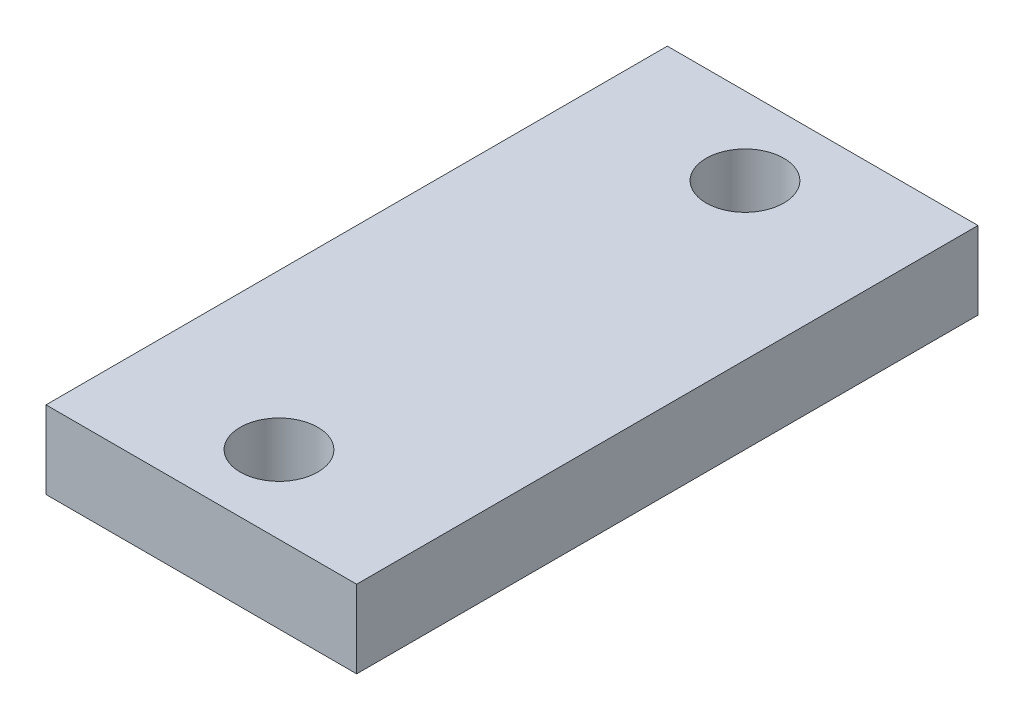
ISO-10303-21;
HEADER;
FILE_DESCRIPTION(('STEP AP214'),'2;1');
FILE_NAME('part.step','',(''),(''),'','','');
FILE_SCHEMA(('AUTOMOTIVE_DESIGN { 1 0 10303 214 1 1 1 1 }'));
ENDSEC;
DATA;
#1=APPLICATION_CONTEXT('core data for automotive mechanical design processes');
#2=APPLICATION_PROTOCOL_DEFINITION('international standard','automotive_design',2000,#1);
#3=PRODUCT_CONTEXT('',#1,'mechanical');
#4=PRODUCT('Part','Part','',(#3));
#5=PRODUCT_RELATED_PRODUCT_CATEGORY('part','',(#4));
#6=PRODUCT_DEFINITION_FORMATION('','',#4);
#7=PRODUCT_DEFINITION_CONTEXT('part definition',#1,'design');
#8=PRODUCT_DEFINITION('design','',#6,#7);
#9=PRODUCT_DEFINITION_SHAPE('','',#8);
#10=(LENGTH_UNIT() NAMED_UNIT(*) SI_UNIT(.MILLI.,.METRE.));
#11=(NAMED_UNIT(*) PLANE_ANGLE_UNIT() SI_UNIT($,.RADIAN.));
#12=(NAMED_UNIT(*) SI_UNIT($,.STERADIAN.) SOLID_ANGLE_UNIT());
#13=UNCERTAINTY_MEASURE_WITH_UNIT(LENGTH_MEASURE(1.E-05),#10,'distance_accuracy_value','');
#14=(GEOMETRIC_REPRESENTATION_CONTEXT(3) GLOBAL_UNCERTAINTY_ASSIGNED_CONTEXT((#13)) GLOBAL_UNIT_ASSIGNED_CONTEXT((#10,
#11,#12)) REPRESENTATION_CONTEXT('',''));
#15=CARTESIAN_POINT('',(0.,0.,0.));
#16=DIRECTION('',(0.,0.,1.));
#17=DIRECTION('',(1.,0.,0.));
#18=AXIS2_PLACEMENT_3D('',#15,#16,#17);
#19=CARTESIAN_POINT('',(12.7,6.35,0.));
#20=DIRECTION('',(-1.,0.,0.));
#21=DIRECTION('',(0.,0.,1.));
#22=AXIS2_PLACEMENT_3D('',#19,#20,#21);
#23=PLANE('',#22);
#24=DIRECTION('',(0.,0.,-1.));
#25=VECTOR('',#24,1.);
#26=CARTESIAN_POINT('',(12.7,0.,0.));
#27=LINE('',#26,#25);
#28=CARTESIAN_POINT('',(12.7,0.,25.4));
#29=VERTEX_POINT('',#28);
#30=CARTESIAN_POINT('',(12.7,0.,-25.4));
#31=VERTEX_POINT('',#30);
#32=EDGE_CURVE('E102',#29,#31,#27,.T.);
#33=ORIENTED_EDGE('',*,*,#32,.T.);
#34=DIRECTION('',(0.,-1.,0.));
#35=VECTOR('',#34,1.);
#36=CARTESIAN_POINT('',(12.7,6.35,-25.4));
#37=LINE('',#36,#35);
#38=CARTESIAN_POINT('',(12.7,6.35,-25.4));
#39=VERTEX_POINT('',#38);
#40=EDGE_CURVE('E11',#39,#31,#37,.T.);
#41=ORIENTED_EDGE('',*,*,#40,.F.);
#42=DIRECTION('',(0.,0.,-1.));
#43=VECTOR('',#42,1.);
#44=CARTESIAN_POINT('',(12.7,6.35,0.));
#45=LINE('',#44,#43);
#46=CARTESIAN_POINT('',(12.7,6.35,25.4));
#47=VERTEX_POINT('',#46);
#48=EDGE_CURVE('E72',#47,#39,#45,.T.);
#49=ORIENTED_EDGE('',*,*,#48,.F.);
#50=DIRECTION('',(0.,-1.,0.));
#51=VECTOR('',#50,1.);
#52=CARTESIAN_POINT('',(12.7,6.35,25.4));
#53=LINE('',#52,#51);
#54=EDGE_CURVE('E98',#47,#29,#53,.T.);
#55=ORIENTED_EDGE('',*,*,#54,.T.);
#56=EDGE_LOOP('',(#33,#41,#49,#55));
#57=FACE_BOUND('',#56,.T.);
#58=ADVANCED_FACE('F32',(#57),#23,.F.);
#59=CARTESIAN_POINT('',(0.,6.35,-25.4));
#60=DIRECTION('',(0.,0.,-1.));
#61=DIRECTION('',(-1.,0.,0.));
#62=AXIS2_PLACEMENT_3D('',#59,#60,#61);
#63=PLANE('',#62);
#64=DIRECTION('',(1.,0.,0.));
#65=VECTOR('',#64,1.);
#66=CARTESIAN_POINT('',(0.,0.,-25.4));
#67=LINE('',#66,#65);
#68=CARTESIAN_POINT('',(-12.7,0.,-25.4));
#69=VERTEX_POINT('',#68);
#70=EDGE_CURVE('E81',#69,#31,#67,.T.);
#71=ORIENTED_EDGE('',*,*,#70,.F.);
#72=DIRECTION('',(0.,-1.,0.));
#73=VECTOR('',#72,1.);
#74=CARTESIAN_POINT('',(-12.7,6.35,-25.4));
#75=LINE('',#74,#73);
#76=CARTESIAN_POINT('',(-12.7,6.35,-25.4));
#77=VERTEX_POINT('',#76);
#78=EDGE_CURVE('E41',#77,#69,#75,.T.);
#79=ORIENTED_EDGE('',*,*,#78,.F.);
#80=DIRECTION('',(1.,0.,0.));
#81=VECTOR('',#80,1.);
#82=CARTESIAN_POINT('',(0.,6.35,-25.4));
#83=LINE('',#82,#81);
#84=EDGE_CURVE('E79',#77,#39,#83,.T.);
#85=ORIENTED_EDGE('',*,*,#84,.T.);
#86=ORIENTED_EDGE('',*,*,#40,.T.);
#87=EDGE_LOOP('',(#71,#79,#85,#86));
#88=FACE_BOUND('',#87,.T.);
#89=ADVANCED_FACE('F78',(#88),#63,.T.);
#90=CARTESIAN_POINT('',(-12.7,6.35,0.));
#91=DIRECTION('',(-1.,0.,0.));
#92=DIRECTION('',(0.,0.,1.));
#93=AXIS2_PLACEMENT_3D('',#90,#91,#92);
#94=PLANE('',#93);
#95=DIRECTION('',(0.,0.,-1.));
#96=VECTOR('',#95,1.);
#97=CARTESIAN_POINT('',(-12.7,0.,0.));
#98=LINE('',#97,#96);
#99=CARTESIAN_POINT('',(-12.7,0.,25.4));
#100=VERTEX_POINT('',#99);
#101=EDGE_CURVE('E106',#100,#69,#98,.T.);
#102=ORIENTED_EDGE('',*,*,#101,.F.);
#103=DIRECTION('',(0.,-1.,0.));
#104=VECTOR('',#103,1.);
#105=CARTESIAN_POINT('',(-12.7,6.35,25.4));
#106=LINE('',#105,#104);
#107=CARTESIAN_POINT('',(-12.7,6.35,25.4));
#108=VERTEX_POINT('',#107);
#109=EDGE_CURVE('E64',#108,#100,#106,.T.);
#110=ORIENTED_EDGE('',*,*,#109,.F.);
#111=DIRECTION('',(0.,0.,-1.));
#112=VECTOR('',#111,1.);
#113=CARTESIAN_POINT('',(-12.7,6.35,0.));
#114=LINE('',#113,#112);
#115=EDGE_CURVE('E88',#108,#77,#114,.T.);
#116=ORIENTED_EDGE('',*,*,#115,.T.);
#117=ORIENTED_EDGE('',*,*,#78,.T.);
#118=EDGE_LOOP('',(#102,#110,#116,#117));
#119=FACE_BOUND('',#118,.T.);
#120=ADVANCED_FACE('F90',(#119),#94,.T.);
#121=CARTESIAN_POINT('',(0.,6.35,25.4));
#122=DIRECTION('',(0.,0.,-1.));
#123=DIRECTION('',(-1.,0.,0.));
#124=AXIS2_PLACEMENT_3D('',#121,#122,#123);
#125=PLANE('',#124);
#126=DIRECTION('',(1.,0.,0.));
#127=VECTOR('',#126,1.);
#128=CARTESIAN_POINT('',(0.,0.,25.4));
#129=LINE('',#128,#127);
#130=EDGE_CURVE('E67',#100,#29,#129,.T.);
#131=ORIENTED_EDGE('',*,*,#130,.T.);
#132=ORIENTED_EDGE('',*,*,#54,.F.);
#133=DIRECTION('',(1.,0.,0.));
#134=VECTOR('',#133,1.);
#135=CARTESIAN_POINT('',(0.,6.35,25.4));
#136=LINE('',#135,#134);
#137=EDGE_CURVE('E49',#108,#47,#136,.T.);
#138=ORIENTED_EDGE('',*,*,#137,.F.);
#139=ORIENTED_EDGE('',*,*,#109,.T.);
#140=EDGE_LOOP('',(#131,#132,#138,#139));
#141=FACE_BOUND('',#140,.T.);
#142=ADVANCED_FACE('F134',(#141),#125,.F.);
#143=CARTESIAN_POINT('',(0.,6.35,19.05));
#144=DIRECTION('',(0.,-1.,0.));
#145=DIRECTION('',(0.,0.,-1.));
#146=AXIS2_PLACEMENT_3D('',#143,#144,#145);
#147=CYLINDRICAL_SURFACE('',#146,3.175);
#148=CARTESIAN_POINT('',(0.,6.35,19.05));
#149=DIRECTION('',(0.,1.,0.));
#150=DIRECTION('',(0.,0.,1.));
#151=AXIS2_PLACEMENT_3D('',#148,#149,#150);
#152=CIRCLE('',#151,3.175);
#153=CARTESIAN_POINT('',(0.,6.35,22.225));
#154=VERTEX_POINT('',#153);
#155=EDGE_CURVE('E112',#154,#154,#152,.T.);
#156=ORIENTED_EDGE('',*,*,#155,.T.);
#157=EDGE_LOOP('',(#156));
#158=FACE_BOUND('',#157,.T.);
#159=CARTESIAN_POINT('',(0.,0.,19.05));
#160=DIRECTION('',(0.,1.,0.));
#161=DIRECTION('',(0.,0.,1.));
#162=AXIS2_PLACEMENT_3D('',#159,#160,#161);
#163=CIRCLE('',#162,3.175);
#164=CARTESIAN_POINT('',(0.,0.,22.225));
#165=VERTEX_POINT('',#164);
#166=EDGE_CURVE('E99',#165,#165,#163,.T.);
#167=ORIENTED_EDGE('',*,*,#166,.F.);
#168=EDGE_LOOP('',(#167));
#169=FACE_BOUND('',#168,.T.);
#170=ADVANCED_FACE('F34',(#158,#169),#147,.F.);
#171=CARTESIAN_POINT('',(0.,6.35,-19.05));
#172=DIRECTION('',(0.,-1.,0.));
#173=DIRECTION('',(0.,0.,-1.));
#174=AXIS2_PLACEMENT_3D('',#171,#172,#173);
#175=CYLINDRICAL_SURFACE('',#174,3.175);
#176=CARTESIAN_POINT('',(0.,6.35,-19.05));
#177=DIRECTION('',(0.,1.,0.));
#178=DIRECTION('',(0.,0.,1.));
#179=AXIS2_PLACEMENT_3D('',#176,#177,#178);
#180=CIRCLE('',#179,3.175);
#181=CARTESIAN_POINT('',(0.,6.35,-15.875));
#182=VERTEX_POINT('',#181);
#183=EDGE_CURVE('E92',#182,#182,#180,.T.);
#184=ORIENTED_EDGE('',*,*,#183,.T.);
#185=EDGE_LOOP('',(#184));
#186=FACE_BOUND('',#185,.T.);
#187=CARTESIAN_POINT('',(0.,0.,-19.05));
#188=DIRECTION('',(0.,1.,0.));
#189=DIRECTION('',(0.,0.,1.));
#190=AXIS2_PLACEMENT_3D('',#187,#188,#189);
#191=CIRCLE('',#190,3.175);
#192=CARTESIAN_POINT('',(0.,0.,-15.875));
#193=VERTEX_POINT('',#192);
#194=EDGE_CURVE('E109',#193,#193,#191,.T.);
#195=ORIENTED_EDGE('',*,*,#194,.F.);
#196=EDGE_LOOP('',(#195));
#197=FACE_BOUND('',#196,.T.);
#198=ADVANCED_FACE('F124',(#186,#197),#175,.F.);
#199=CARTESIAN_POINT('',(0.,6.35,0.));
#200=DIRECTION('',(0.,1.,0.));
#201=DIRECTION('',(0.,0.,1.));
#202=AXIS2_PLACEMENT_3D('',#199,#200,#201);
#203=PLANE('',#202);
#204=ORIENTED_EDGE('',*,*,#155,.F.);
#205=EDGE_LOOP('',(#204));
#206=FACE_BOUND('',#205,.T.);
#207=ORIENTED_EDGE('',*,*,#48,.T.);
#208=ORIENTED_EDGE('',*,*,#84,.F.);
#209=ORIENTED_EDGE('',*,*,#115,.F.);
#210=ORIENTED_EDGE('',*,*,#137,.T.);
#211=EDGE_LOOP('',(#207,#208,#209,#210));
#212=FACE_BOUND('',#211,.T.);
#213=ORIENTED_EDGE('',*,*,#183,.F.);
#214=EDGE_LOOP('',(#213));
#215=FACE_BOUND('',#214,.T.);
#216=ADVANCED_FACE('F86',(#206,#212,#215),#203,.T.);
#217=CARTESIAN_POINT('',(0.,0.,0.));
#218=DIRECTION('',(0.,1.,0.));
#219=DIRECTION('',(0.,0.,1.));
#220=AXIS2_PLACEMENT_3D('',#217,#218,#219);
#221=PLANE('',#220);
#222=ORIENTED_EDGE('',*,*,#166,.T.);
#223=EDGE_LOOP('',(#222));
#224=FACE_BOUND('',#223,.T.);
#225=ORIENTED_EDGE('',*,*,#32,.F.);
#226=ORIENTED_EDGE('',*,*,#130,.F.);
#227=ORIENTED_EDGE('',*,*,#101,.T.);
#228=ORIENTED_EDGE('',*,*,#70,.T.);
#229=EDGE_LOOP('',(#225,#226,#227,#228));
#230=FACE_BOUND('',#229,.T.);
#231=ORIENTED_EDGE('',*,*,#194,.T.);
#232=EDGE_LOOP('',(#231));
#233=FACE_BOUND('',#232,.T.);
#234=ADVANCED_FACE('F117',(#224,#230,#233),#221,.F.);
#235=CLOSED_SHELL('',(#58,#89,#120,#142,#170,#198,#216,#234));
#236=MANIFOLD_SOLID_BREP('B2',#235);
#237=ADVANCED_BREP_SHAPE_REPRESENTATION('',(#18,#236),#14);
#238=SHAPE_DEFINITION_REPRESENTATION(#9,#237);
ENDSEC;
END-ISO-10303-21;
